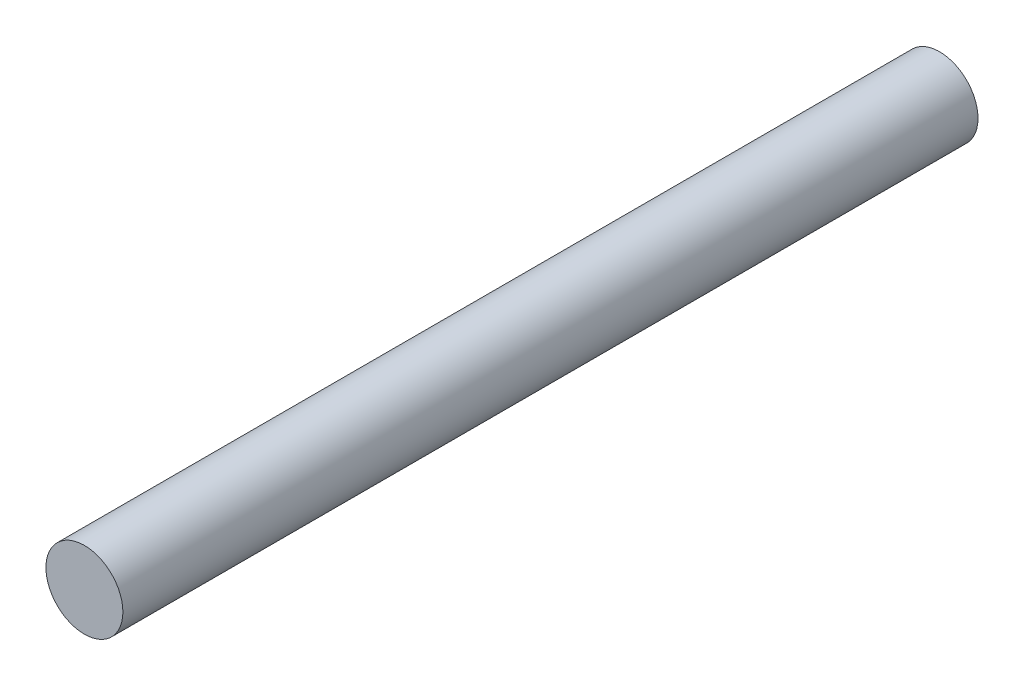
ISO-10303-21;
HEADER;
FILE_DESCRIPTION(('STEP AP214'),'2;1');
FILE_NAME('part.step','',(''),(''),'','','');
FILE_SCHEMA(('AUTOMOTIVE_DESIGN { 1 0 10303 214 1 1 1 1 }'));
ENDSEC;
DATA;
#1=APPLICATION_CONTEXT('core data for automotive mechanical design processes');
#2=APPLICATION_PROTOCOL_DEFINITION('international standard','automotive_design',2000,#1);
#3=PRODUCT_CONTEXT('',#1,'mechanical');
#4=PRODUCT('Part','Part','',(#3));
#5=PRODUCT_RELATED_PRODUCT_CATEGORY('part','',(#4));
#6=PRODUCT_DEFINITION_FORMATION('','',#4);
#7=PRODUCT_DEFINITION_CONTEXT('part definition',#1,'design');
#8=PRODUCT_DEFINITION('design','',#6,#7);
#9=PRODUCT_DEFINITION_SHAPE('','',#8);
#10=(LENGTH_UNIT() NAMED_UNIT(*) SI_UNIT(.MILLI.,.METRE.));
#11=(NAMED_UNIT(*) PLANE_ANGLE_UNIT() SI_UNIT($,.RADIAN.));
#12=(NAMED_UNIT(*) SI_UNIT($,.STERADIAN.) SOLID_ANGLE_UNIT());
#13=UNCERTAINTY_MEASURE_WITH_UNIT(LENGTH_MEASURE(1.E-05),#10,'distance_accuracy_value','');
#14=(GEOMETRIC_REPRESENTATION_CONTEXT(3) GLOBAL_UNCERTAINTY_ASSIGNED_CONTEXT((#13)) GLOBAL_UNIT_ASSIGNED_CONTEXT((#10,
#11,#12)) REPRESENTATION_CONTEXT('',''));
#15=CARTESIAN_POINT('',(0.,0.,0.));
#16=DIRECTION('',(0.,0.,1.));
#17=DIRECTION('',(1.,0.,0.));
#18=AXIS2_PLACEMENT_3D('',#15,#16,#17);
#19=CARTESIAN_POINT('',(0.,0.,-22.225));
#20=DIRECTION('',(0.,0.,1.));
#21=DIRECTION('',(1.,0.,0.));
#22=AXIS2_PLACEMENT_3D('',#19,#20,#21);
#23=CYLINDRICAL_SURFACE('',#22,1.);
#24=CARTESIAN_POINT('',(0.,0.,-22.225));
#25=DIRECTION('',(0.,0.,1.));
#26=DIRECTION('',(1.,0.,0.));
#27=AXIS2_PLACEMENT_3D('',#24,#25,#26);
#28=CIRCLE('',#27,1.);
#29=CARTESIAN_POINT('',(1.,0.,-22.225));
#30=VERTEX_POINT('',#29);
#31=EDGE_CURVE('E10',#30,#30,#28,.T.);
#32=ORIENTED_EDGE('',*,*,#31,.T.);
#33=EDGE_LOOP('',(#32));
#34=FACE_BOUND('',#33,.T.);
#35=CARTESIAN_POINT('',(0.,0.,0.));
#36=DIRECTION('',(0.,0.,1.));
#37=DIRECTION('',(1.,0.,0.));
#38=AXIS2_PLACEMENT_3D('',#35,#36,#37);
#39=CIRCLE('',#38,1.);
#40=CARTESIAN_POINT('',(1.,0.,0.));
#41=VERTEX_POINT('',#40);
#42=EDGE_CURVE('E34',#41,#41,#39,.T.);
#43=ORIENTED_EDGE('',*,*,#42,.F.);
#44=EDGE_LOOP('',(#43));
#45=FACE_BOUND('',#44,.T.);
#46=ADVANCED_FACE('F31',(#34,#45),#23,.T.);
#47=CARTESIAN_POINT('',(0.,0.,-22.225));
#48=DIRECTION('',(0.,0.,1.));
#49=DIRECTION('',(1.,0.,0.));
#50=AXIS2_PLACEMENT_3D('',#47,#48,#49);
#51=PLANE('',#50);
#52=ORIENTED_EDGE('',*,*,#31,.F.);
#53=EDGE_LOOP('',(#52));
#54=FACE_BOUND('',#53,.T.);
#55=ADVANCED_FACE('F46',(#54),#51,.F.);
#56=CARTESIAN_POINT('',(0.,0.,0.));
#57=DIRECTION('',(0.,0.,1.));
#58=DIRECTION('',(1.,0.,0.));
#59=AXIS2_PLACEMENT_3D('',#56,#57,#58);
#60=PLANE('',#59);
#61=ORIENTED_EDGE('',*,*,#42,.T.);
#62=EDGE_LOOP('',(#61));
#63=FACE_BOUND('',#62,.T.);
#64=ADVANCED_FACE('F43',(#63),#60,.T.);
#65=CLOSED_SHELL('',(#46,#55,#64));
#66=MANIFOLD_SOLID_BREP('B2',#65);
#67=ADVANCED_BREP_SHAPE_REPRESENTATION('',(#18,#66),#14);
#68=SHAPE_DEFINITION_REPRESENTATION(#9,#67);
ENDSEC;
END-ISO-10303-21;
